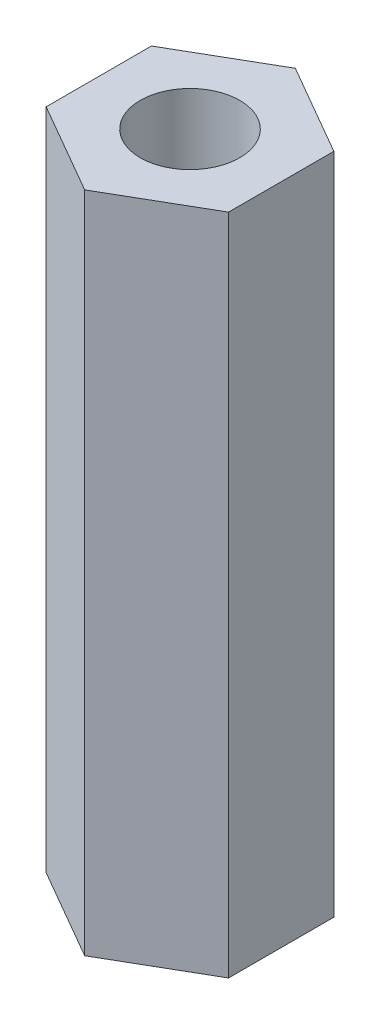
ISO-10303-21;
HEADER;
FILE_DESCRIPTION(('STEP AP214'),'2;1');
FILE_NAME('part.step','',(''),(''),'','','');
FILE_SCHEMA(('AUTOMOTIVE_DESIGN { 1 0 10303 214 1 1 1 1 }'));
ENDSEC;
DATA;
#1=APPLICATION_CONTEXT('core data for automotive mechanical design processes');
#2=APPLICATION_PROTOCOL_DEFINITION('international standard','automotive_design',2000,#1);
#3=PRODUCT_CONTEXT('',#1,'mechanical');
#4=PRODUCT('Part','Part','',(#3));
#5=PRODUCT_RELATED_PRODUCT_CATEGORY('part','',(#4));
#6=PRODUCT_DEFINITION_FORMATION('','',#4);
#7=PRODUCT_DEFINITION_CONTEXT('part definition',#1,'design');
#8=PRODUCT_DEFINITION('design','',#6,#7);
#9=PRODUCT_DEFINITION_SHAPE('','',#8);
#10=(LENGTH_UNIT() NAMED_UNIT(*) SI_UNIT(.MILLI.,.METRE.));
#11=(NAMED_UNIT(*) PLANE_ANGLE_UNIT() SI_UNIT($,.RADIAN.));
#12=(NAMED_UNIT(*) SI_UNIT($,.STERADIAN.) SOLID_ANGLE_UNIT());
#13=UNCERTAINTY_MEASURE_WITH_UNIT(LENGTH_MEASURE(1.E-05),#10,'distance_accuracy_value','');
#14=(GEOMETRIC_REPRESENTATION_CONTEXT(3) GLOBAL_UNCERTAINTY_ASSIGNED_CONTEXT((#13)) GLOBAL_UNIT_ASSIGNED_CONTEXT((#10,
#11,#12)) REPRESENTATION_CONTEXT('',''));
#15=CARTESIAN_POINT('',(0.,0.,0.));
#16=DIRECTION('',(0.,0.,1.));
#17=DIRECTION('',(1.,0.,0.));
#18=AXIS2_PLACEMENT_3D('',#15,#16,#17);
#19=CARTESIAN_POINT('',(0.,20.,3.17542648054297));
#20=DIRECTION('',(0.,1.,0.));
#21=DIRECTION('',(0.,0.,1.));
#22=AXIS2_PLACEMENT_3D('',#19,#20,#21);
#23=PLANE('',#22);
#24=DIRECTION('',(0.866025403784438,0.,0.5));
#25=VECTOR('',#24,1.);
#26=CARTESIAN_POINT('',(-2.75000000000002,20.,1.58771324027148));
#27=LINE('',#26,#25);
#28=CARTESIAN_POINT('',(-2.75000000000002,20.,1.58771324027148));
#29=VERTEX_POINT('',#28);
#30=CARTESIAN_POINT('',(0.,20.,3.17542648054297));
#31=VERTEX_POINT('',#30);
#32=EDGE_CURVE('E131',#29,#31,#27,.T.);
#33=ORIENTED_EDGE('',*,*,#32,.T.);
#34=DIRECTION('',(0.866025403784439,0.,-0.5));
#35=VECTOR('',#34,1.);
#36=CARTESIAN_POINT('',(0.,20.,3.17542648054297));
#37=LINE('',#36,#35);
#38=CARTESIAN_POINT('',(2.75000000000002,20.,1.58771324027148));
#39=VERTEX_POINT('',#38);
#40=EDGE_CURVE('E89',#31,#39,#37,.T.);
#41=ORIENTED_EDGE('',*,*,#40,.T.);
#42=DIRECTION('',(0.,0.,-1.));
#43=VECTOR('',#42,1.);
#44=CARTESIAN_POINT('',(2.75000000000002,20.,1.58771324027148));
#45=LINE('',#44,#43);
#46=CARTESIAN_POINT('',(2.75000000000002,20.,-1.58771324027149));
#47=VERTEX_POINT('',#46);
#48=EDGE_CURVE('E102',#39,#47,#45,.T.);
#49=ORIENTED_EDGE('',*,*,#48,.T.);
#50=DIRECTION('',(-0.866025403784439,0.,-0.5));
#51=VECTOR('',#50,1.);
#52=CARTESIAN_POINT('',(2.75000000000002,20.,-1.58771324027149));
#53=LINE('',#52,#51);
#54=CARTESIAN_POINT('',(0.,20.,-3.17542648054297));
#55=VERTEX_POINT('',#54);
#56=EDGE_CURVE('E96',#47,#55,#53,.T.);
#57=ORIENTED_EDGE('',*,*,#56,.T.);
#58=DIRECTION('',(-0.866025403784438,0.,0.5));
#59=VECTOR('',#58,1.);
#60=CARTESIAN_POINT('',(0.,20.,-3.17542648054297));
#61=LINE('',#60,#59);
#62=CARTESIAN_POINT('',(-2.75000000000002,20.,-1.58771324027148));
#63=VERTEX_POINT('',#62);
#64=EDGE_CURVE('E100',#55,#63,#61,.T.);
#65=ORIENTED_EDGE('',*,*,#64,.T.);
#66=DIRECTION('',(0.,0.,1.));
#67=VECTOR('',#66,1.);
#68=CARTESIAN_POINT('',(-2.75000000000002,20.,-1.58771324027148));
#69=LINE('',#68,#67);
#70=EDGE_CURVE('E52',#63,#29,#69,.T.);
#71=ORIENTED_EDGE('',*,*,#70,.T.);
#72=EDGE_LOOP('',(#33,#41,#49,#57,#65,#71));
#73=FACE_BOUND('',#72,.T.);
#74=CARTESIAN_POINT('',(0.,20.,0.));
#75=DIRECTION('',(0.,1.,0.));
#76=DIRECTION('',(0.,0.,1.));
#77=AXIS2_PLACEMENT_3D('',#74,#75,#76);
#78=CIRCLE('',#77,1.5);
#79=CARTESIAN_POINT('',(0.,20.,1.5));
#80=VERTEX_POINT('',#79);
#81=EDGE_CURVE('E124',#80,#80,#78,.T.);
#82=ORIENTED_EDGE('',*,*,#81,.F.);
#83=EDGE_LOOP('',(#82));
#84=FACE_BOUND('',#83,.T.);
#85=ADVANCED_FACE('F35',(#73,#84),#23,.T.);
#86=CARTESIAN_POINT('',(0.,0.,3.17542648054297));
#87=DIRECTION('',(0.,1.,0.));
#88=DIRECTION('',(0.,0.,1.));
#89=AXIS2_PLACEMENT_3D('',#86,#87,#88);
#90=PLANE('',#89);
#91=DIRECTION('',(0.866025403784438,0.,0.5));
#92=VECTOR('',#91,1.);
#93=CARTESIAN_POINT('',(-2.75000000000002,0.,1.58771324027148));
#94=LINE('',#93,#92);
#95=CARTESIAN_POINT('',(-2.75000000000002,0.,1.58771324027148));
#96=VERTEX_POINT('',#95);
#97=CARTESIAN_POINT('',(0.,0.,3.17542648054297));
#98=VERTEX_POINT('',#97);
#99=EDGE_CURVE('E120',#96,#98,#94,.T.);
#100=ORIENTED_EDGE('',*,*,#99,.F.);
#101=DIRECTION('',(0.,0.,1.));
#102=VECTOR('',#101,1.);
#103=CARTESIAN_POINT('',(-2.75000000000002,0.,-1.58771324027148));
#104=LINE('',#103,#102);
#105=CARTESIAN_POINT('',(-2.75000000000002,0.,-1.58771324027148));
#106=VERTEX_POINT('',#105);
#107=EDGE_CURVE('E81',#106,#96,#104,.T.);
#108=ORIENTED_EDGE('',*,*,#107,.F.);
#109=DIRECTION('',(-0.866025403784438,0.,0.5));
#110=VECTOR('',#109,1.);
#111=CARTESIAN_POINT('',(0.,0.,-3.17542648054297));
#112=LINE('',#111,#110);
#113=CARTESIAN_POINT('',(0.,0.,-3.17542648054297));
#114=VERTEX_POINT('',#113);
#115=EDGE_CURVE('E75',#114,#106,#112,.T.);
#116=ORIENTED_EDGE('',*,*,#115,.F.);
#117=DIRECTION('',(-0.866025403784439,0.,-0.5));
#118=VECTOR('',#117,1.);
#119=CARTESIAN_POINT('',(2.75000000000002,0.,-1.58771324027149));
#120=LINE('',#119,#118);
#121=CARTESIAN_POINT('',(2.75000000000002,0.,-1.58771324027149));
#122=VERTEX_POINT('',#121);
#123=EDGE_CURVE('E110',#122,#114,#120,.T.);
#124=ORIENTED_EDGE('',*,*,#123,.F.);
#125=DIRECTION('',(0.,0.,-1.));
#126=VECTOR('',#125,1.);
#127=CARTESIAN_POINT('',(2.75000000000002,0.,1.58771324027148));
#128=LINE('',#127,#126);
#129=CARTESIAN_POINT('',(2.75000000000002,0.,1.58771324027148));
#130=VERTEX_POINT('',#129);
#131=EDGE_CURVE('E126',#130,#122,#128,.T.);
#132=ORIENTED_EDGE('',*,*,#131,.F.);
#133=DIRECTION('',(0.866025403784439,0.,-0.5));
#134=VECTOR('',#133,1.);
#135=CARTESIAN_POINT('',(0.,0.,3.17542648054297));
#136=LINE('',#135,#134);
#137=EDGE_CURVE('E123',#98,#130,#136,.T.);
#138=ORIENTED_EDGE('',*,*,#137,.F.);
#139=EDGE_LOOP('',(#100,#108,#116,#124,#132,#138));
#140=FACE_BOUND('',#139,.T.);
#141=CARTESIAN_POINT('',(0.,0.,0.));
#142=DIRECTION('',(0.,1.,0.));
#143=DIRECTION('',(0.,0.,1.));
#144=AXIS2_PLACEMENT_3D('',#141,#142,#143);
#145=CIRCLE('',#144,1.5);
#146=CARTESIAN_POINT('',(0.,0.,1.5));
#147=VERTEX_POINT('',#146);
#148=EDGE_CURVE('E224',#147,#147,#145,.T.);
#149=ORIENTED_EDGE('',*,*,#148,.T.);
#150=EDGE_LOOP('',(#149));
#151=FACE_BOUND('',#150,.T.);
#152=ADVANCED_FACE('F140',(#140,#151),#90,.F.);
#153=CARTESIAN_POINT('',(-2.75000000000002,20.,1.58771324027148));
#154=DIRECTION('',(0.5,0.,-0.866025403784439));
#155=DIRECTION('',(-0.866025403784439,0.,-0.5));
#156=AXIS2_PLACEMENT_3D('',#153,#154,#155);
#157=PLANE('',#156);
#158=ORIENTED_EDGE('',*,*,#99,.T.);
#159=DIRECTION('',(0.,-1.,0.));
#160=VECTOR('',#159,1.);
#161=CARTESIAN_POINT('',(0.,20.,3.17542648054297));
#162=LINE('',#161,#160);
#163=EDGE_CURVE('E11',#31,#98,#162,.T.);
#164=ORIENTED_EDGE('',*,*,#163,.F.);
#165=ORIENTED_EDGE('',*,*,#32,.F.);
#166=DIRECTION('',(0.,-1.,0.));
#167=VECTOR('',#166,1.);
#168=CARTESIAN_POINT('',(-2.75000000000002,20.,1.58771324027148));
#169=LINE('',#168,#167);
#170=EDGE_CURVE('E116',#29,#96,#169,.T.);
#171=ORIENTED_EDGE('',*,*,#170,.T.);
#172=EDGE_LOOP('',(#158,#164,#165,#171));
#173=FACE_BOUND('',#172,.T.);
#174=ADVANCED_FACE('F37',(#173),#157,.F.);
#175=CARTESIAN_POINT('',(0.,20.,3.17542648054297));
#176=DIRECTION('',(-0.5,0.,-0.866025403784438));
#177=DIRECTION('',(-0.866025403784439,0.,0.5));
#178=AXIS2_PLACEMENT_3D('',#175,#176,#177);
#179=PLANE('',#178);
#180=ORIENTED_EDGE('',*,*,#137,.T.);
#181=DIRECTION('',(0.,-1.,0.));
#182=VECTOR('',#181,1.);
#183=CARTESIAN_POINT('',(2.75000000000002,20.,1.58771324027148));
#184=LINE('',#183,#182);
#185=EDGE_CURVE('E44',#39,#130,#184,.T.);
#186=ORIENTED_EDGE('',*,*,#185,.F.);
#187=ORIENTED_EDGE('',*,*,#40,.F.);
#188=ORIENTED_EDGE('',*,*,#163,.T.);
#189=EDGE_LOOP('',(#180,#186,#187,#188));
#190=FACE_BOUND('',#189,.T.);
#191=ADVANCED_FACE('F165',(#190),#179,.F.);
#192=CARTESIAN_POINT('',(2.75000000000002,20.,1.58771324027148));
#193=DIRECTION('',(-1.,0.,0.));
#194=DIRECTION('',(0.,0.,1.));
#195=AXIS2_PLACEMENT_3D('',#192,#193,#194);
#196=PLANE('',#195);
#197=ORIENTED_EDGE('',*,*,#131,.T.);
#198=DIRECTION('',(0.,-1.,0.));
#199=VECTOR('',#198,1.);
#200=CARTESIAN_POINT('',(2.75000000000002,20.,-1.58771324027149));
#201=LINE('',#200,#199);
#202=EDGE_CURVE('E111',#47,#122,#201,.T.);
#203=ORIENTED_EDGE('',*,*,#202,.F.);
#204=ORIENTED_EDGE('',*,*,#48,.F.);
#205=ORIENTED_EDGE('',*,*,#185,.T.);
#206=EDGE_LOOP('',(#197,#203,#204,#205));
#207=FACE_BOUND('',#206,.T.);
#208=ADVANCED_FACE('F137',(#207),#196,.F.);
#209=CARTESIAN_POINT('',(2.75000000000002,20.,-1.58771324027149));
#210=DIRECTION('',(-0.5,0.,0.866025403784439));
#211=DIRECTION('',(0.866025403784439,0.,0.5));
#212=AXIS2_PLACEMENT_3D('',#209,#210,#211);
#213=PLANE('',#212);
#214=ORIENTED_EDGE('',*,*,#123,.T.);
#215=DIRECTION('',(0.,-1.,0.));
#216=VECTOR('',#215,1.);
#217=CARTESIAN_POINT('',(0.,20.,-3.17542648054297));
#218=LINE('',#217,#216);
#219=EDGE_CURVE('E107',#55,#114,#218,.T.);
#220=ORIENTED_EDGE('',*,*,#219,.F.);
#221=ORIENTED_EDGE('',*,*,#56,.F.);
#222=ORIENTED_EDGE('',*,*,#202,.T.);
#223=EDGE_LOOP('',(#214,#220,#221,#222));
#224=FACE_BOUND('',#223,.T.);
#225=ADVANCED_FACE('F108',(#224),#213,.F.);
#226=CARTESIAN_POINT('',(0.,20.,-3.17542648054297));
#227=DIRECTION('',(0.5,0.,0.866025403784438));
#228=DIRECTION('',(0.866025403784438,0.,-0.5));
#229=AXIS2_PLACEMENT_3D('',#226,#227,#228);
#230=PLANE('',#229);
#231=ORIENTED_EDGE('',*,*,#115,.T.);
#232=DIRECTION('',(0.,-1.,0.));
#233=VECTOR('',#232,1.);
#234=CARTESIAN_POINT('',(-2.75000000000002,20.,-1.58771324027148));
#235=LINE('',#234,#233);
#236=EDGE_CURVE('E112',#63,#106,#235,.T.);
#237=ORIENTED_EDGE('',*,*,#236,.F.);
#238=ORIENTED_EDGE('',*,*,#64,.F.);
#239=ORIENTED_EDGE('',*,*,#219,.T.);
#240=EDGE_LOOP('',(#231,#237,#238,#239));
#241=FACE_BOUND('',#240,.T.);
#242=ADVANCED_FACE('F114',(#241),#230,.F.);
#243=CARTESIAN_POINT('',(-2.75000000000002,20.,-1.58771324027148));
#244=DIRECTION('',(1.,0.,0.));
#245=DIRECTION('',(0.,0.,-1.));
#246=AXIS2_PLACEMENT_3D('',#243,#244,#245);
#247=PLANE('',#246);
#248=ORIENTED_EDGE('',*,*,#107,.T.);
#249=ORIENTED_EDGE('',*,*,#170,.F.);
#250=ORIENTED_EDGE('',*,*,#70,.F.);
#251=ORIENTED_EDGE('',*,*,#236,.T.);
#252=EDGE_LOOP('',(#248,#249,#250,#251));
#253=FACE_BOUND('',#252,.T.);
#254=ADVANCED_FACE('F145',(#253),#247,.F.);
#255=CARTESIAN_POINT('',(0.,20.,0.));
#256=DIRECTION('',(0.,-1.,0.));
#257=DIRECTION('',(0.,0.,-1.));
#258=AXIS2_PLACEMENT_3D('',#255,#256,#257);
#259=CYLINDRICAL_SURFACE('',#258,1.5);
#260=ORIENTED_EDGE('',*,*,#81,.T.);
#261=EDGE_LOOP('',(#260));
#262=FACE_BOUND('',#261,.T.);
#263=ORIENTED_EDGE('',*,*,#148,.F.);
#264=EDGE_LOOP('',(#263));
#265=FACE_BOUND('',#264,.T.);
#266=ADVANCED_FACE('F147',(#262,#265),#259,.F.);
#267=CLOSED_SHELL('',(#85,#152,#174,#191,#208,#225,#242,#254,#266));
#268=MANIFOLD_SOLID_BREP('B2',#267);
#269=ADVANCED_BREP_SHAPE_REPRESENTATION('',(#18,#268),#14);
#270=SHAPE_DEFINITION_REPRESENTATION(#9,#269);
ENDSEC;
END-ISO-10303-21;
